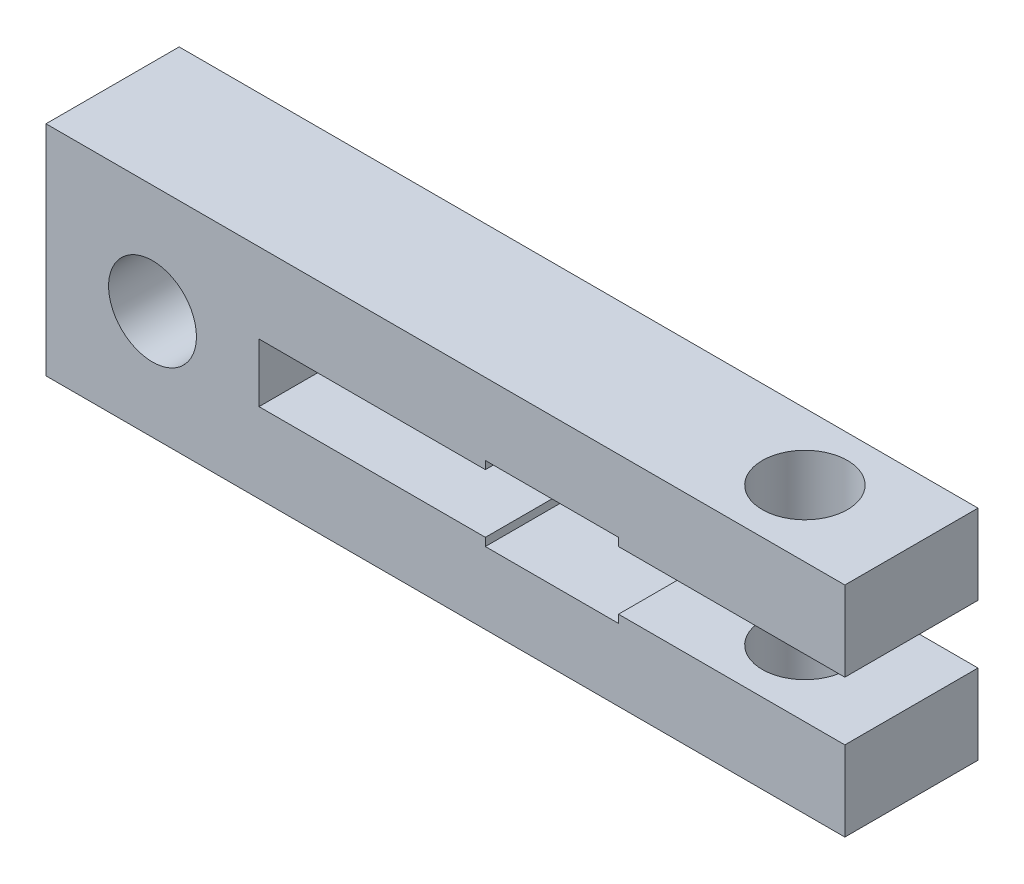
ISO-10303-21;
HEADER;
FILE_DESCRIPTION(('STEP AP214'),'2;1');
FILE_NAME('part.step','',(''),(''),'','','');
FILE_SCHEMA(('AUTOMOTIVE_DESIGN { 1 0 10303 214 1 1 1 1 }'));
ENDSEC;
DATA;
#1=APPLICATION_CONTEXT('core data for automotive mechanical design processes');
#2=APPLICATION_PROTOCOL_DEFINITION('international standard','automotive_design',2000,#1);
#3=PRODUCT_CONTEXT('',#1,'mechanical');
#4=PRODUCT('Part','Part','',(#3));
#5=PRODUCT_RELATED_PRODUCT_CATEGORY('part','',(#4));
#6=PRODUCT_DEFINITION_FORMATION('','',#4);
#7=PRODUCT_DEFINITION_CONTEXT('part definition',#1,'design');
#8=PRODUCT_DEFINITION('design','',#6,#7);
#9=PRODUCT_DEFINITION_SHAPE('','',#8);
#10=(LENGTH_UNIT() NAMED_UNIT(*) SI_UNIT(.MILLI.,.METRE.));
#11=(NAMED_UNIT(*) PLANE_ANGLE_UNIT() SI_UNIT($,.RADIAN.));
#12=(NAMED_UNIT(*) SI_UNIT($,.STERADIAN.) SOLID_ANGLE_UNIT());
#13=UNCERTAINTY_MEASURE_WITH_UNIT(LENGTH_MEASURE(1.E-05),#10,'distance_accuracy_value','');
#14=(GEOMETRIC_REPRESENTATION_CONTEXT(3) GLOBAL_UNCERTAINTY_ASSIGNED_CONTEXT((#13)) GLOBAL_UNIT_ASSIGNED_CONTEXT((#10,
#11,#12)) REPRESENTATION_CONTEXT('',''));
#15=CARTESIAN_POINT('',(0.,0.,0.));
#16=DIRECTION('',(0.,0.,1.));
#17=DIRECTION('',(1.,0.,0.));
#18=AXIS2_PLACEMENT_3D('',#15,#16,#17);
#19=CARTESIAN_POINT('',(0.,1.1,2.5));
#20=DIRECTION('',(0.,1.,0.));
#21=DIRECTION('',(-1.,0.,0.));
#22=AXIS2_PLACEMENT_3D('',#19,#20,#21);
#23=PLANE('',#22);
#24=CARTESIAN_POINT('',(11.,1.1,0.));
#25=DIRECTION('',(0.,1.,0.));
#26=DIRECTION('',(-1.,0.,0.));
#27=AXIS2_PLACEMENT_3D('',#24,#25,#26);
#28=CIRCLE('',#27,1.6);
#29=CARTESIAN_POINT('',(9.4,1.1,0.));
#30=VERTEX_POINT('',#29);
#31=EDGE_CURVE('E175',#30,#30,#28,.T.);
#32=ORIENTED_EDGE('',*,*,#31,.T.);
#33=EDGE_LOOP('',(#32));
#34=FACE_BOUND('',#33,.T.);
#35=DIRECTION('',(1.,0.,0.));
#36=VECTOR('',#35,1.);
#37=CARTESIAN_POINT('',(0.,1.1,2.5));
#38=LINE('',#37,#36);
#39=CARTESIAN_POINT('',(6.5,1.1,2.5));
#40=VERTEX_POINT('',#39);
#41=CARTESIAN_POINT('',(15.,1.1,2.5));
#42=VERTEX_POINT('',#41);
#43=EDGE_CURVE('E230',#40,#42,#38,.T.);
#44=ORIENTED_EDGE('',*,*,#43,.F.);
#45=DIRECTION('',(0.,0.,-1.));
#46=VECTOR('',#45,1.);
#47=CARTESIAN_POINT('',(6.5,1.1,2.5));
#48=LINE('',#47,#46);
#49=CARTESIAN_POINT('',(6.5,1.1,-2.5));
#50=VERTEX_POINT('',#49);
#51=EDGE_CURVE('E169',#40,#50,#48,.T.);
#52=ORIENTED_EDGE('',*,*,#51,.T.);
#53=DIRECTION('',(1.,0.,0.));
#54=VECTOR('',#53,1.);
#55=CARTESIAN_POINT('',(0.,1.1,-2.5));
#56=LINE('',#55,#54);
#57=CARTESIAN_POINT('',(15.,1.1,-2.5));
#58=VERTEX_POINT('',#57);
#59=EDGE_CURVE('E263',#50,#58,#56,.T.);
#60=ORIENTED_EDGE('',*,*,#59,.T.);
#61=DIRECTION('',(0.,0.,-1.));
#62=VECTOR('',#61,1.);
#63=CARTESIAN_POINT('',(15.,1.1,2.5));
#64=LINE('',#63,#62);
#65=EDGE_CURVE('E313',#42,#58,#64,.T.);
#66=ORIENTED_EDGE('',*,*,#65,.F.);
#67=EDGE_LOOP('',(#44,#52,#60,#66));
#68=FACE_BOUND('',#67,.T.);
#69=ADVANCED_FACE('F46',(#34,#68),#23,.F.);
#70=CARTESIAN_POINT('',(0.,-1.1,2.5));
#71=DIRECTION('',(0.,1.,0.));
#72=DIRECTION('',(-1.,0.,0.));
#73=AXIS2_PLACEMENT_3D('',#70,#71,#72);
#74=PLANE('',#73);
#75=CARTESIAN_POINT('',(11.,-1.1,0.));
#76=DIRECTION('',(0.,1.,0.));
#77=DIRECTION('',(-1.,0.,0.));
#78=AXIS2_PLACEMENT_3D('',#75,#76,#77);
#79=CIRCLE('',#78,1.6);
#80=CARTESIAN_POINT('',(9.4,-1.1,0.));
#81=VERTEX_POINT('',#80);
#82=EDGE_CURVE('E492',#81,#81,#79,.T.);
#83=ORIENTED_EDGE('',*,*,#82,.F.);
#84=EDGE_LOOP('',(#83));
#85=FACE_BOUND('',#84,.T.);
#86=DIRECTION('',(0.,0.,-1.));
#87=VECTOR('',#86,1.);
#88=CARTESIAN_POINT('',(6.5,-1.1,2.5));
#89=LINE('',#88,#87);
#90=CARTESIAN_POINT('',(6.5,-1.1,2.5));
#91=VERTEX_POINT('',#90);
#92=CARTESIAN_POINT('',(6.5,-1.1,-2.5));
#93=VERTEX_POINT('',#92);
#94=EDGE_CURVE('E218',#91,#93,#89,.T.);
#95=ORIENTED_EDGE('',*,*,#94,.F.);
#96=DIRECTION('',(1.,0.,0.));
#97=VECTOR('',#96,1.);
#98=CARTESIAN_POINT('',(0.,-1.1,2.5));
#99=LINE('',#98,#97);
#100=CARTESIAN_POINT('',(15.,-1.1,2.5));
#101=VERTEX_POINT('',#100);
#102=EDGE_CURVE('E248',#91,#101,#99,.T.);
#103=ORIENTED_EDGE('',*,*,#102,.T.);
#104=DIRECTION('',(0.,0.,-1.));
#105=VECTOR('',#104,1.);
#106=CARTESIAN_POINT('',(15.,-1.1,2.5));
#107=LINE('',#106,#105);
#108=CARTESIAN_POINT('',(15.,-1.1,-2.5));
#109=VERTEX_POINT('',#108);
#110=EDGE_CURVE('E297',#101,#109,#107,.T.);
#111=ORIENTED_EDGE('',*,*,#110,.T.);
#112=DIRECTION('',(1.,0.,0.));
#113=VECTOR('',#112,1.);
#114=CARTESIAN_POINT('',(0.,-1.1,-2.5));
#115=LINE('',#114,#113);
#116=EDGE_CURVE('E283',#93,#109,#115,.T.);
#117=ORIENTED_EDGE('',*,*,#116,.F.);
#118=EDGE_LOOP('',(#95,#103,#111,#117));
#119=FACE_BOUND('',#118,.T.);
#120=ADVANCED_FACE('F365',(#85,#119),#74,.T.);
#121=CARTESIAN_POINT('',(-7.00000000000002,1.1,-2.5));
#122=VERTEX_POINT('',#121);
#123=CARTESIAN_POINT('',(1.5,1.1,-2.5));
#124=VERTEX_POINT('',#123);
#125=EDGE_CURVE('E258',#122,#124,#56,.T.);
#126=ORIENTED_EDGE('',*,*,#125,.T.);
#127=DIRECTION('',(0.,0.,1.));
#128=VECTOR('',#127,1.);
#129=CARTESIAN_POINT('',(1.5,1.1,2.5));
#130=LINE('',#129,#128);
#131=CARTESIAN_POINT('',(1.5,1.1,2.5));
#132=VERTEX_POINT('',#131);
#133=EDGE_CURVE('E212',#124,#132,#130,.T.);
#134=ORIENTED_EDGE('',*,*,#133,.T.);
#135=CARTESIAN_POINT('',(-7.00000000000002,1.1,2.5));
#136=VERTEX_POINT('',#135);
#137=EDGE_CURVE('E226',#136,#132,#38,.T.);
#138=ORIENTED_EDGE('',*,*,#137,.F.);
#139=DIRECTION('',(0.,0.,-1.));
#140=VECTOR('',#139,1.);
#141=CARTESIAN_POINT('',(-7.00000000000002,1.1,2.5));
#142=LINE('',#141,#140);
#143=EDGE_CURVE('E257',#136,#122,#142,.T.);
#144=ORIENTED_EDGE('',*,*,#143,.T.);
#145=EDGE_LOOP('',(#126,#134,#138,#144));
#146=FACE_BOUND('',#145,.T.);
#147=ADVANCED_FACE('F48',(#146),#23,.F.);
#148=CARTESIAN_POINT('',(15.,0.,2.5));
#149=DIRECTION('',(-1.,0.,0.));
#150=DIRECTION('',(0.,0.,1.));
#151=AXIS2_PLACEMENT_3D('',#148,#149,#150);
#152=PLANE('',#151);
#153=DIRECTION('',(0.,1.,0.));
#154=VECTOR('',#153,1.);
#155=CARTESIAN_POINT('',(15.,0.,-2.5));
#156=LINE('',#155,#154);
#157=CARTESIAN_POINT('',(15.,4.1,-2.5));
#158=VERTEX_POINT('',#157);
#159=EDGE_CURVE('E262',#58,#158,#156,.T.);
#160=ORIENTED_EDGE('',*,*,#159,.T.);
#161=DIRECTION('',(0.,0.,-1.));
#162=VECTOR('',#161,1.);
#163=CARTESIAN_POINT('',(15.,4.1,2.5));
#164=LINE('',#163,#162);
#165=CARTESIAN_POINT('',(15.,4.1,2.5));
#166=VERTEX_POINT('',#165);
#167=EDGE_CURVE('E310',#166,#158,#164,.T.);
#168=ORIENTED_EDGE('',*,*,#167,.F.);
#169=DIRECTION('',(0.,1.,0.));
#170=VECTOR('',#169,1.);
#171=CARTESIAN_POINT('',(15.,0.,2.5));
#172=LINE('',#171,#170);
#173=EDGE_CURVE('E229',#42,#166,#172,.T.);
#174=ORIENTED_EDGE('',*,*,#173,.F.);
#175=ORIENTED_EDGE('',*,*,#65,.T.);
#176=EDGE_LOOP('',(#160,#168,#174,#175));
#177=FACE_BOUND('',#176,.T.);
#178=ADVANCED_FACE('F384',(#177),#152,.F.);
#179=CARTESIAN_POINT('',(0.,4.1,2.5));
#180=DIRECTION('',(0.,1.,0.));
#181=DIRECTION('',(-1.,0.,0.));
#182=AXIS2_PLACEMENT_3D('',#179,#180,#181);
#183=PLANE('',#182);
#184=CARTESIAN_POINT('',(11.,4.1,0.));
#185=DIRECTION('',(0.,1.,0.));
#186=DIRECTION('',(-1.,0.,0.));
#187=AXIS2_PLACEMENT_3D('',#184,#185,#186);
#188=CIRCLE('',#187,1.6);
#189=CARTESIAN_POINT('',(9.4,4.1,0.));
#190=VERTEX_POINT('',#189);
#191=EDGE_CURVE('E489',#190,#190,#188,.T.);
#192=ORIENTED_EDGE('',*,*,#191,.F.);
#193=EDGE_LOOP('',(#192));
#194=FACE_BOUND('',#193,.T.);
#195=DIRECTION('',(1.,0.,0.));
#196=VECTOR('',#195,1.);
#197=CARTESIAN_POINT('',(0.,4.1,-2.5));
#198=LINE('',#197,#196);
#199=CARTESIAN_POINT('',(-15.,4.1,-2.5));
#200=VERTEX_POINT('',#199);
#201=EDGE_CURVE('E267',#200,#158,#198,.T.);
#202=ORIENTED_EDGE('',*,*,#201,.F.);
#203=DIRECTION('',(0.,0.,-1.));
#204=VECTOR('',#203,1.);
#205=CARTESIAN_POINT('',(-15.,4.1,2.5));
#206=LINE('',#205,#204);
#207=CARTESIAN_POINT('',(-15.,4.1,2.5));
#208=VERTEX_POINT('',#207);
#209=EDGE_CURVE('E307',#208,#200,#206,.T.);
#210=ORIENTED_EDGE('',*,*,#209,.F.);
#211=DIRECTION('',(1.,0.,0.));
#212=VECTOR('',#211,1.);
#213=CARTESIAN_POINT('',(0.,4.1,2.5));
#214=LINE('',#213,#212);
#215=EDGE_CURVE('E233',#208,#166,#214,.T.);
#216=ORIENTED_EDGE('',*,*,#215,.T.);
#217=ORIENTED_EDGE('',*,*,#167,.T.);
#218=EDGE_LOOP('',(#202,#210,#216,#217));
#219=FACE_BOUND('',#218,.T.);
#220=ADVANCED_FACE('F381',(#194,#219),#183,.T.);
#221=CARTESIAN_POINT('',(-15.,0.,2.5));
#222=DIRECTION('',(-1.,0.,0.));
#223=DIRECTION('',(0.,-1.,0.));
#224=AXIS2_PLACEMENT_3D('',#221,#222,#223);
#225=PLANE('',#224);
#226=DIRECTION('',(0.,1.,0.));
#227=VECTOR('',#226,1.);
#228=CARTESIAN_POINT('',(-15.,0.,-2.5));
#229=LINE('',#228,#227);
#230=CARTESIAN_POINT('',(-15.,-4.1,-2.5));
#231=VERTEX_POINT('',#230);
#232=EDGE_CURVE('E271',#231,#200,#229,.T.);
#233=ORIENTED_EDGE('',*,*,#232,.F.);
#234=DIRECTION('',(0.,0.,-1.));
#235=VECTOR('',#234,1.);
#236=CARTESIAN_POINT('',(-15.,-4.1,2.5));
#237=LINE('',#236,#235);
#238=CARTESIAN_POINT('',(-15.,-4.1,2.5));
#239=VERTEX_POINT('',#238);
#240=EDGE_CURVE('E304',#239,#231,#237,.T.);
#241=ORIENTED_EDGE('',*,*,#240,.F.);
#242=DIRECTION('',(0.,1.,0.));
#243=VECTOR('',#242,1.);
#244=CARTESIAN_POINT('',(-15.,0.,2.5));
#245=LINE('',#244,#243);
#246=EDGE_CURVE('E237',#239,#208,#245,.T.);
#247=ORIENTED_EDGE('',*,*,#246,.T.);
#248=ORIENTED_EDGE('',*,*,#209,.T.);
#249=EDGE_LOOP('',(#233,#241,#247,#248));
#250=FACE_BOUND('',#249,.T.);
#251=ADVANCED_FACE('F376',(#250),#225,.T.);
#252=CARTESIAN_POINT('',(0.,-4.1,2.5));
#253=DIRECTION('',(0.,1.,0.));
#254=DIRECTION('',(-1.,0.,0.));
#255=AXIS2_PLACEMENT_3D('',#252,#253,#254);
#256=PLANE('',#255);
#257=CARTESIAN_POINT('',(11.,-4.1,0.));
#258=DIRECTION('',(0.,1.,0.));
#259=DIRECTION('',(-1.,0.,0.));
#260=AXIS2_PLACEMENT_3D('',#257,#258,#259);
#261=CIRCLE('',#260,1.6);
#262=CARTESIAN_POINT('',(9.4,-4.1,0.));
#263=VERTEX_POINT('',#262);
#264=EDGE_CURVE('E50',#263,#263,#261,.T.);
#265=ORIENTED_EDGE('',*,*,#264,.T.);
#266=EDGE_LOOP('',(#265));
#267=FACE_BOUND('',#266,.T.);
#268=DIRECTION('',(1.,0.,0.));
#269=VECTOR('',#268,1.);
#270=CARTESIAN_POINT('',(0.,-4.1,-2.5));
#271=LINE('',#270,#269);
#272=CARTESIAN_POINT('',(15.,-4.1,-2.5));
#273=VERTEX_POINT('',#272);
#274=EDGE_CURVE('E275',#231,#273,#271,.T.);
#275=ORIENTED_EDGE('',*,*,#274,.T.);
#276=DIRECTION('',(0.,0.,-1.));
#277=VECTOR('',#276,1.);
#278=CARTESIAN_POINT('',(15.,-4.1,2.5));
#279=LINE('',#278,#277);
#280=CARTESIAN_POINT('',(15.,-4.1,2.5));
#281=VERTEX_POINT('',#280);
#282=EDGE_CURVE('E301',#281,#273,#279,.T.);
#283=ORIENTED_EDGE('',*,*,#282,.F.);
#284=DIRECTION('',(1.,0.,0.));
#285=VECTOR('',#284,1.);
#286=CARTESIAN_POINT('',(0.,-4.1,2.5));
#287=LINE('',#286,#285);
#288=EDGE_CURVE('E241',#239,#281,#287,.T.);
#289=ORIENTED_EDGE('',*,*,#288,.F.);
#290=ORIENTED_EDGE('',*,*,#240,.T.);
#291=EDGE_LOOP('',(#275,#283,#289,#290));
#292=FACE_BOUND('',#291,.T.);
#293=ADVANCED_FACE('F373',(#267,#292),#256,.F.);
#294=CARTESIAN_POINT('',(15.,0.,2.5));
#295=DIRECTION('',(1.,0.,0.));
#296=DIRECTION('',(0.,1.,0.));
#297=AXIS2_PLACEMENT_3D('',#294,#295,#296);
#298=PLANE('',#297);
#299=DIRECTION('',(0.,-1.,0.));
#300=VECTOR('',#299,1.);
#301=CARTESIAN_POINT('',(15.,0.,-2.5));
#302=LINE('',#301,#300);
#303=EDGE_CURVE('E279',#109,#273,#302,.T.);
#304=ORIENTED_EDGE('',*,*,#303,.F.);
#305=ORIENTED_EDGE('',*,*,#110,.F.);
#306=DIRECTION('',(0.,-1.,0.));
#307=VECTOR('',#306,1.);
#308=CARTESIAN_POINT('',(15.,0.,2.5));
#309=LINE('',#308,#307);
#310=EDGE_CURVE('E244',#101,#281,#309,.T.);
#311=ORIENTED_EDGE('',*,*,#310,.T.);
#312=ORIENTED_EDGE('',*,*,#282,.T.);
#313=EDGE_LOOP('',(#304,#305,#311,#312));
#314=FACE_BOUND('',#313,.T.);
#315=ADVANCED_FACE('F369',(#314),#298,.T.);
#316=DIRECTION('',(0.,0.,1.));
#317=VECTOR('',#316,1.);
#318=CARTESIAN_POINT('',(1.5,-1.1,2.5));
#319=LINE('',#318,#317);
#320=CARTESIAN_POINT('',(1.5,-1.1,-2.5));
#321=VERTEX_POINT('',#320);
#322=CARTESIAN_POINT('',(1.5,-1.1,2.5));
#323=VERTEX_POINT('',#322);
#324=EDGE_CURVE('E205',#321,#323,#319,.T.);
#325=ORIENTED_EDGE('',*,*,#324,.F.);
#326=CARTESIAN_POINT('',(-7.00000000000002,-1.1,-2.5));
#327=VERTEX_POINT('',#326);
#328=EDGE_CURVE('E284',#327,#321,#115,.T.);
#329=ORIENTED_EDGE('',*,*,#328,.F.);
#330=DIRECTION('',(0.,0.,-1.));
#331=VECTOR('',#330,1.);
#332=CARTESIAN_POINT('',(-7.00000000000002,-1.1,2.5));
#333=LINE('',#332,#331);
#334=CARTESIAN_POINT('',(-7.00000000000002,-1.1,2.5));
#335=VERTEX_POINT('',#334);
#336=EDGE_CURVE('E294',#335,#327,#333,.T.);
#337=ORIENTED_EDGE('',*,*,#336,.F.);
#338=EDGE_CURVE('E249',#335,#323,#99,.T.);
#339=ORIENTED_EDGE('',*,*,#338,.T.);
#340=EDGE_LOOP('',(#325,#329,#337,#339));
#341=FACE_BOUND('',#340,.T.);
#342=ADVANCED_FACE('F339',(#341),#74,.T.);
#343=CARTESIAN_POINT('',(-7.00000000000002,0.,2.5));
#344=DIRECTION('',(1.,0.,0.));
#345=DIRECTION('',(0.,0.,-1.));
#346=AXIS2_PLACEMENT_3D('',#343,#344,#345);
#347=PLANE('',#346);
#348=DIRECTION('',(0.,-1.,0.));
#349=VECTOR('',#348,1.);
#350=CARTESIAN_POINT('',(-7.00000000000002,0.,-2.5));
#351=LINE('',#350,#349);
#352=EDGE_CURVE('E288',#122,#327,#351,.T.);
#353=ORIENTED_EDGE('',*,*,#352,.F.);
#354=ORIENTED_EDGE('',*,*,#143,.F.);
#355=DIRECTION('',(0.,-1.,0.));
#356=VECTOR('',#355,1.);
#357=CARTESIAN_POINT('',(-7.00000000000002,0.,2.5));
#358=LINE('',#357,#356);
#359=EDGE_CURVE('E253',#136,#335,#358,.T.);
#360=ORIENTED_EDGE('',*,*,#359,.T.);
#361=ORIENTED_EDGE('',*,*,#336,.T.);
#362=EDGE_LOOP('',(#353,#354,#360,#361));
#363=FACE_BOUND('',#362,.T.);
#364=ADVANCED_FACE('F345',(#363),#347,.T.);
#365=CARTESIAN_POINT('',(0.,0.,2.5));
#366=DIRECTION('',(0.,0.,1.));
#367=DIRECTION('',(1.,0.,0.));
#368=AXIS2_PLACEMENT_3D('',#365,#366,#367);
#369=PLANE('',#368);
#370=DIRECTION('',(0.,1.,0.));
#371=VECTOR('',#370,1.);
#372=CARTESIAN_POINT('',(6.5,-1.4,2.5));
#373=LINE('',#372,#371);
#374=CARTESIAN_POINT('',(6.5,-1.4,2.5));
#375=VERTEX_POINT('',#374);
#376=EDGE_CURVE('E174',#375,#91,#373,.T.);
#377=ORIENTED_EDGE('',*,*,#376,.F.);
#378=DIRECTION('',(1.,0.,0.));
#379=VECTOR('',#378,1.);
#380=CARTESIAN_POINT('',(1.5,-1.4,2.5));
#381=LINE('',#380,#379);
#382=CARTESIAN_POINT('',(1.5,-1.4,2.5));
#383=VERTEX_POINT('',#382);
#384=EDGE_CURVE('E183',#383,#375,#381,.T.);
#385=ORIENTED_EDGE('',*,*,#384,.F.);
#386=DIRECTION('',(0.,-1.,0.));
#387=VECTOR('',#386,1.);
#388=CARTESIAN_POINT('',(1.5,-1.4,2.5));
#389=LINE('',#388,#387);
#390=EDGE_CURVE('E191',#323,#383,#389,.T.);
#391=ORIENTED_EDGE('',*,*,#390,.F.);
#392=ORIENTED_EDGE('',*,*,#338,.F.);
#393=ORIENTED_EDGE('',*,*,#359,.F.);
#394=ORIENTED_EDGE('',*,*,#137,.T.);
#395=CARTESIAN_POINT('',(1.5,1.4,2.5));
#396=VERTEX_POINT('',#395);
#397=EDGE_CURVE('E189',#396,#132,#389,.T.);
#398=ORIENTED_EDGE('',*,*,#397,.F.);
#399=DIRECTION('',(-1.,0.,0.));
#400=VECTOR('',#399,1.);
#401=CARTESIAN_POINT('',(1.5,1.4,2.5));
#402=LINE('',#401,#400);
#403=CARTESIAN_POINT('',(6.5,1.4,2.5));
#404=VERTEX_POINT('',#403);
#405=EDGE_CURVE('E178',#404,#396,#402,.T.);
#406=ORIENTED_EDGE('',*,*,#405,.F.);
#407=EDGE_CURVE('E163',#40,#404,#373,.T.);
#408=ORIENTED_EDGE('',*,*,#407,.F.);
#409=ORIENTED_EDGE('',*,*,#43,.T.);
#410=ORIENTED_EDGE('',*,*,#173,.T.);
#411=ORIENTED_EDGE('',*,*,#215,.F.);
#412=ORIENTED_EDGE('',*,*,#246,.F.);
#413=ORIENTED_EDGE('',*,*,#288,.T.);
#414=ORIENTED_EDGE('',*,*,#310,.F.);
#415=ORIENTED_EDGE('',*,*,#102,.F.);
#416=EDGE_LOOP('',(#377,#385,#391,#392,#393,#394,#398,#406,#408,#409,#410,#411,#412,#413,#414,#415));
#417=FACE_BOUND('',#416,.T.);
#418=CARTESIAN_POINT('',(-11.,0.,2.5));
#419=DIRECTION('',(0.,0.,1.));
#420=DIRECTION('',(1.,0.,0.));
#421=AXIS2_PLACEMENT_3D('',#418,#419,#420);
#422=CIRCLE('',#421,1.65);
#423=CARTESIAN_POINT('',(-9.35,0.,2.5));
#424=VERTEX_POINT('',#423);
#425=EDGE_CURVE('E221',#424,#424,#422,.T.);
#426=ORIENTED_EDGE('',*,*,#425,.F.);
#427=EDGE_LOOP('',(#426));
#428=FACE_BOUND('',#427,.T.);
#429=ADVANCED_FACE('F186',(#417,#428),#369,.T.);
#430=CARTESIAN_POINT('',(0.,0.,-2.5));
#431=DIRECTION('',(0.,0.,1.));
#432=DIRECTION('',(1.,0.,0.));
#433=AXIS2_PLACEMENT_3D('',#430,#431,#432);
#434=PLANE('',#433);
#435=DIRECTION('',(1.,0.,0.));
#436=VECTOR('',#435,1.);
#437=CARTESIAN_POINT('',(0.,-1.4,-2.5));
#438=LINE('',#437,#436);
#439=CARTESIAN_POINT('',(1.5,-1.4,-2.5));
#440=VERTEX_POINT('',#439);
#441=CARTESIAN_POINT('',(6.5,-1.4,-2.5));
#442=VERTEX_POINT('',#441);
#443=EDGE_CURVE('E56',#440,#442,#438,.T.);
#444=ORIENTED_EDGE('',*,*,#443,.T.);
#445=DIRECTION('',(0.,1.,0.));
#446=VECTOR('',#445,1.);
#447=CARTESIAN_POINT('',(6.5,0.,-2.5));
#448=LINE('',#447,#446);
#449=EDGE_CURVE('E11',#442,#93,#448,.T.);
#450=ORIENTED_EDGE('',*,*,#449,.T.);
#451=ORIENTED_EDGE('',*,*,#116,.T.);
#452=ORIENTED_EDGE('',*,*,#303,.T.);
#453=ORIENTED_EDGE('',*,*,#274,.F.);
#454=ORIENTED_EDGE('',*,*,#232,.T.);
#455=ORIENTED_EDGE('',*,*,#201,.T.);
#456=ORIENTED_EDGE('',*,*,#159,.F.);
#457=ORIENTED_EDGE('',*,*,#59,.F.);
#458=CARTESIAN_POINT('',(6.5,1.4,-2.5));
#459=VERTEX_POINT('',#458);
#460=EDGE_CURVE('E58',#50,#459,#448,.T.);
#461=ORIENTED_EDGE('',*,*,#460,.T.);
#462=DIRECTION('',(-1.,0.,0.));
#463=VECTOR('',#462,1.);
#464=CARTESIAN_POINT('',(0.,1.4,-2.5));
#465=LINE('',#464,#463);
#466=CARTESIAN_POINT('',(1.5,1.4,-2.5));
#467=VERTEX_POINT('',#466);
#468=EDGE_CURVE('E181',#459,#467,#465,.T.);
#469=ORIENTED_EDGE('',*,*,#468,.T.);
#470=DIRECTION('',(0.,-1.,0.));
#471=VECTOR('',#470,1.);
#472=CARTESIAN_POINT('',(1.5,0.,-2.5));
#473=LINE('',#472,#471);
#474=EDGE_CURVE('E322',#467,#124,#473,.T.);
#475=ORIENTED_EDGE('',*,*,#474,.T.);
#476=ORIENTED_EDGE('',*,*,#125,.F.);
#477=ORIENTED_EDGE('',*,*,#352,.T.);
#478=ORIENTED_EDGE('',*,*,#328,.T.);
#479=EDGE_CURVE('E325',#321,#440,#473,.T.);
#480=ORIENTED_EDGE('',*,*,#479,.T.);
#481=EDGE_LOOP('',(#444,#450,#451,#452,#453,#454,#455,#456,#457,#461,#469,#475,#476,#477,#478,#480));
#482=FACE_BOUND('',#481,.T.);
#483=CARTESIAN_POINT('',(-11.,0.,-2.5));
#484=DIRECTION('',(0.,0.,1.));
#485=DIRECTION('',(1.,0.,0.));
#486=AXIS2_PLACEMENT_3D('',#483,#484,#485);
#487=CIRCLE('',#486,1.65);
#488=CARTESIAN_POINT('',(-9.35,0.,-2.5));
#489=VERTEX_POINT('',#488);
#490=EDGE_CURVE('E225',#489,#489,#487,.T.);
#491=ORIENTED_EDGE('',*,*,#490,.T.);
#492=EDGE_LOOP('',(#491));
#493=FACE_BOUND('',#492,.T.);
#494=ADVANCED_FACE('F332',(#482,#493),#434,.F.);
#495=CARTESIAN_POINT('',(-11.,0.,-11.5));
#496=DIRECTION('',(0.,0.,1.));
#497=DIRECTION('',(1.,0.,0.));
#498=AXIS2_PLACEMENT_3D('',#495,#496,#497);
#499=CYLINDRICAL_SURFACE('',#498,1.65);
#500=ORIENTED_EDGE('',*,*,#425,.T.);
#501=EDGE_LOOP('',(#500));
#502=FACE_BOUND('',#501,.T.);
#503=ORIENTED_EDGE('',*,*,#490,.F.);
#504=EDGE_LOOP('',(#503));
#505=FACE_BOUND('',#504,.T.);
#506=ADVANCED_FACE('F432',(#502,#505),#499,.F.);
#507=CARTESIAN_POINT('',(1.5,1.4,-11.5));
#508=DIRECTION('',(0.,1.,0.));
#509=DIRECTION('',(0.,0.,1.));
#510=AXIS2_PLACEMENT_3D('',#507,#508,#509);
#511=PLANE('',#510);
#512=DIRECTION('',(0.,0.,1.));
#513=VECTOR('',#512,1.);
#514=CARTESIAN_POINT('',(6.5,1.4,-11.5));
#515=LINE('',#514,#513);
#516=EDGE_CURVE('E166',#459,#404,#515,.T.);
#517=ORIENTED_EDGE('',*,*,#516,.T.);
#518=ORIENTED_EDGE('',*,*,#405,.T.);
#519=DIRECTION('',(0.,0.,1.));
#520=VECTOR('',#519,1.);
#521=CARTESIAN_POINT('',(1.5,1.4,-11.5));
#522=LINE('',#521,#520);
#523=EDGE_CURVE('E73',#467,#396,#522,.T.);
#524=ORIENTED_EDGE('',*,*,#523,.F.);
#525=ORIENTED_EDGE('',*,*,#468,.F.);
#526=EDGE_LOOP('',(#517,#518,#524,#525));
#527=FACE_BOUND('',#526,.T.);
#528=ADVANCED_FACE('F177',(#527),#511,.F.);
#529=CARTESIAN_POINT('',(1.5,-1.4,-11.5));
#530=DIRECTION('',(-1.,0.,0.));
#531=DIRECTION('',(0.,0.,1.));
#532=AXIS2_PLACEMENT_3D('',#529,#530,#531);
#533=PLANE('',#532);
#534=ORIENTED_EDGE('',*,*,#474,.F.);
#535=ORIENTED_EDGE('',*,*,#523,.T.);
#536=ORIENTED_EDGE('',*,*,#397,.T.);
#537=ORIENTED_EDGE('',*,*,#133,.F.);
#538=EDGE_LOOP('',(#534,#535,#536,#537));
#539=FACE_BOUND('',#538,.T.);
#540=ADVANCED_FACE('F350',(#539),#533,.F.);
#541=CARTESIAN_POINT('',(6.5,-1.4,-11.5));
#542=DIRECTION('',(1.,0.,0.));
#543=DIRECTION('',(0.,0.,-1.));
#544=AXIS2_PLACEMENT_3D('',#541,#542,#543);
#545=PLANE('',#544);
#546=ORIENTED_EDGE('',*,*,#407,.T.);
#547=ORIENTED_EDGE('',*,*,#516,.F.);
#548=ORIENTED_EDGE('',*,*,#460,.F.);
#549=ORIENTED_EDGE('',*,*,#51,.F.);
#550=EDGE_LOOP('',(#546,#547,#548,#549));
#551=FACE_BOUND('',#550,.T.);
#552=ADVANCED_FACE('F165',(#551),#545,.F.);
#553=CARTESIAN_POINT('',(1.5,-1.4,-11.5));
#554=DIRECTION('',(0.,-1.,0.));
#555=DIRECTION('',(0.,0.,-1.));
#556=AXIS2_PLACEMENT_3D('',#553,#554,#555);
#557=PLANE('',#556);
#558=DIRECTION('',(0.,0.,1.));
#559=VECTOR('',#558,1.);
#560=CARTESIAN_POINT('',(1.5,-1.4,-11.5));
#561=LINE('',#560,#559);
#562=EDGE_CURVE('E65',#440,#383,#561,.T.);
#563=ORIENTED_EDGE('',*,*,#562,.T.);
#564=ORIENTED_EDGE('',*,*,#384,.T.);
#565=DIRECTION('',(0.,0.,1.));
#566=VECTOR('',#565,1.);
#567=CARTESIAN_POINT('',(6.5,-1.4,-11.5));
#568=LINE('',#567,#566);
#569=EDGE_CURVE('E202',#442,#375,#568,.T.);
#570=ORIENTED_EDGE('',*,*,#569,.F.);
#571=ORIENTED_EDGE('',*,*,#443,.F.);
#572=EDGE_LOOP('',(#563,#564,#570,#571));
#573=FACE_BOUND('',#572,.T.);
#574=ADVANCED_FACE('F390',(#573),#557,.F.);
#575=ORIENTED_EDGE('',*,*,#94,.T.);
#576=ORIENTED_EDGE('',*,*,#449,.F.);
#577=ORIENTED_EDGE('',*,*,#569,.T.);
#578=ORIENTED_EDGE('',*,*,#376,.T.);
#579=EDGE_LOOP('',(#575,#576,#577,#578));
#580=FACE_BOUND('',#579,.T.);
#581=ADVANCED_FACE('F387',(#580),#545,.F.);
#582=ORIENTED_EDGE('',*,*,#324,.T.);
#583=ORIENTED_EDGE('',*,*,#390,.T.);
#584=ORIENTED_EDGE('',*,*,#562,.F.);
#585=ORIENTED_EDGE('',*,*,#479,.F.);
#586=EDGE_LOOP('',(#582,#583,#584,#585));
#587=FACE_BOUND('',#586,.T.);
#588=ADVANCED_FACE('F336',(#587),#533,.F.);
#589=CARTESIAN_POINT('',(11.,-45.9,0.));
#590=DIRECTION('',(0.,1.,0.));
#591=DIRECTION('',(-1.,0.,0.));
#592=AXIS2_PLACEMENT_3D('',#589,#590,#591);
#593=CYLINDRICAL_SURFACE('',#592,1.6);
#594=ORIENTED_EDGE('',*,*,#82,.T.);
#595=EDGE_LOOP('',(#594));
#596=FACE_BOUND('',#595,.T.);
#597=ORIENTED_EDGE('',*,*,#264,.F.);
#598=EDGE_LOOP('',(#597));
#599=FACE_BOUND('',#598,.T.);
#600=ADVANCED_FACE('F438',(#596,#599),#593,.F.);
#601=ORIENTED_EDGE('',*,*,#191,.T.);
#602=EDGE_LOOP('',(#601));
#603=FACE_BOUND('',#602,.T.);
#604=ORIENTED_EDGE('',*,*,#31,.F.);
#605=EDGE_LOOP('',(#604));
#606=FACE_BOUND('',#605,.T.);
#607=ADVANCED_FACE('F442',(#603,#606),#593,.F.);
#608=CLOSED_SHELL('',(#69,#120,#147,#178,#220,#251,#293,#315,#342,#364,#429,#494,#506,#528,#540,
#552,#574,#581,#588,#600,#607));
#609=MANIFOLD_SOLID_BREP('B2',#608);
#610=ADVANCED_BREP_SHAPE_REPRESENTATION('',(#18,#609),#14);
#611=SHAPE_DEFINITION_REPRESENTATION(#9,#610);
ENDSEC;
END-ISO-10303-21;
